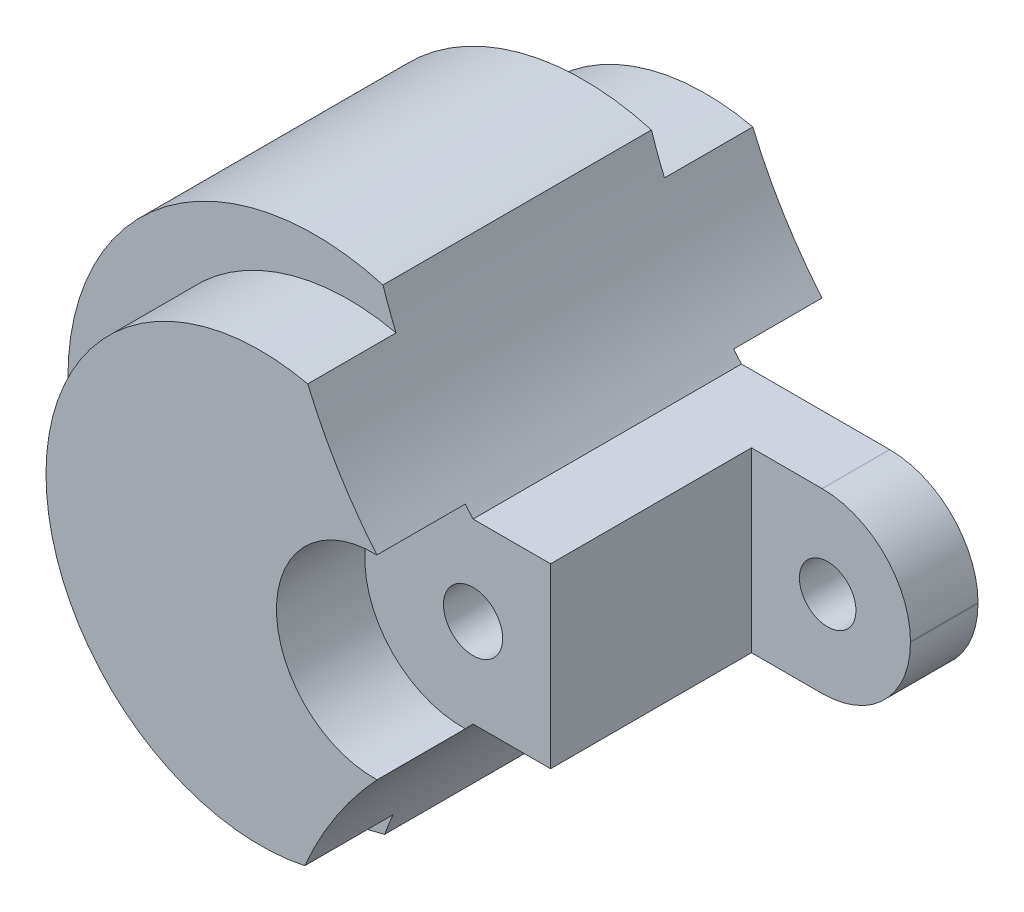
ISO-10303-21;
HEADER;
FILE_DESCRIPTION(('STEP AP214'),'2;1');
FILE_NAME('part.step','',(''),(''),'','','');
FILE_SCHEMA(('AUTOMOTIVE_DESIGN { 1 0 10303 214 1 1 1 1 }'));
ENDSEC;
DATA;
#1=APPLICATION_CONTEXT('core data for automotive mechanical design processes');
#2=APPLICATION_PROTOCOL_DEFINITION('international standard','automotive_design',2000,#1);
#3=PRODUCT_CONTEXT('',#1,'mechanical');
#4=PRODUCT('Part','Part','',(#3));
#5=PRODUCT_RELATED_PRODUCT_CATEGORY('part','',(#4));
#6=PRODUCT_DEFINITION_FORMATION('','',#4);
#7=PRODUCT_DEFINITION_CONTEXT('part definition',#1,'design');
#8=PRODUCT_DEFINITION('design','',#6,#7);
#9=PRODUCT_DEFINITION_SHAPE('','',#8);
#10=(LENGTH_UNIT() NAMED_UNIT(*) SI_UNIT(.MILLI.,.METRE.));
#11=(NAMED_UNIT(*) PLANE_ANGLE_UNIT() SI_UNIT($,.RADIAN.));
#12=(NAMED_UNIT(*) SI_UNIT($,.STERADIAN.) SOLID_ANGLE_UNIT());
#13=UNCERTAINTY_MEASURE_WITH_UNIT(LENGTH_MEASURE(1.E-05),#10,'distance_accuracy_value','');
#14=(GEOMETRIC_REPRESENTATION_CONTEXT(3) GLOBAL_UNCERTAINTY_ASSIGNED_CONTEXT((#13)) GLOBAL_UNIT_ASSIGNED_CONTEXT((#10,
#11,#12)) REPRESENTATION_CONTEXT('',''));
#15=CARTESIAN_POINT('',(0.,0.,0.));
#16=DIRECTION('',(0.,0.,1.));
#17=DIRECTION('',(1.,0.,0.));
#18=AXIS2_PLACEMENT_3D('',#15,#16,#17);
#19=CARTESIAN_POINT('',(-23.5470269701052,15.8760123838213,14.95));
#20=DIRECTION('',(0.,0.,1.));
#21=DIRECTION('',(1.,0.,0.));
#22=AXIS2_PLACEMENT_3D('',#19,#20,#21);
#23=PLANE('',#22);
#24=CARTESIAN_POINT('',(-30.589699273519,16.0095070511293,14.95));
#25=DIRECTION('',(0.,0.,1.));
#26=DIRECTION('',(1.,0.,0.));
#27=AXIS2_PLACEMENT_3D('',#24,#25,#26);
#28=CIRCLE('',#27,12.1384984454512);
#29=CARTESIAN_POINT('',(-27.9081699108447,27.848111056135,14.95));
#30=VERTEX_POINT('',#29);
#31=CARTESIAN_POINT('',(-28.078905501613,4.13352039126898,14.95));
#32=VERTEX_POINT('',#31);
#33=EDGE_CURVE('E50',#30,#32,#28,.T.);
#34=ORIENTED_EDGE('',*,*,#33,.F.);
#35=CARTESIAN_POINT('',(-4.52058876228532,37.6875726493922,14.95));
#36=DIRECTION('',(0.,0.,1.));
#37=DIRECTION('',(1.,0.,0.));
#38=AXIS2_PLACEMENT_3D('',#35,#36,#37);
#39=CIRCLE('',#38,25.3730951290069);
#40=CARTESIAN_POINT('',(-28.6466779395256,29.8309972225613,14.95));
#41=VERTEX_POINT('',#40);
#42=EDGE_CURVE('E260',#41,#30,#39,.T.);
#43=ORIENTED_EDGE('',*,*,#42,.F.);
#44=CARTESIAN_POINT('',(-32.4878901912363,16.3682676168199,14.95));
#45=DIRECTION('',(0.,0.,1.));
#46=DIRECTION('',(1.,0.,0.));
#47=AXIS2_PLACEMENT_3D('',#44,#45,#46);
#48=CIRCLE('',#47,14.);
#49=CARTESIAN_POINT('',(-28.5553209438088,2.93194002650756,14.95));
#50=VERTEX_POINT('',#49);
#51=EDGE_CURVE('E246',#50,#41,#48,.F.);
#52=ORIENTED_EDGE('',*,*,#51,.F.);
#53=CARTESIAN_POINT('',(-8.00801608864321,-4.51963796845459,14.95));
#54=DIRECTION('',(0.,0.,1.));
#55=DIRECTION('',(1.,0.,0.));
#56=AXIS2_PLACEMENT_3D('',#53,#54,#55);
#57=CIRCLE('',#56,21.8567552812881);
#58=EDGE_CURVE('E55',#32,#50,#57,.T.);
#59=ORIENTED_EDGE('',*,*,#58,.F.);
#60=EDGE_LOOP('',(#34,#43,#52,#59));
#61=FACE_BOUND('',#60,.T.);
#62=ADVANCED_FACE('F35',(#61),#23,.T.);
#63=CARTESIAN_POINT('',(-23.5470269701052,15.8760123838213,14.95));
#64=DIRECTION('',(0.,0.,1.));
#65=DIRECTION('',(1.,0.,0.));
#66=AXIS2_PLACEMENT_3D('',#63,#64,#65);
#67=CIRCLE('',#66,1.67396975610176);
#68=CARTESIAN_POINT('',(-21.8730572140035,15.8760123838213,14.95));
#69=VERTEX_POINT('',#68);
#70=EDGE_CURVE('E224',#69,#69,#67,.T.);
#71=ORIENTED_EDGE('',*,*,#70,.F.);
#72=EDGE_LOOP('',(#71));
#73=FACE_BOUND('',#72,.T.);
#74=CARTESIAN_POINT('',(-24.1657631019313,15.9070552291608,14.95));
#75=DIRECTION('',(0.,0.,1.));
#76=DIRECTION('',(1.,0.,0.));
#77=AXIS2_PLACEMENT_3D('',#74,#75,#76);
#78=CIRCLE('',#77,5.51200944546824);
#79=CARTESIAN_POINT('',(-23.9823356469283,10.3980986586583,14.95));
#80=VERTEX_POINT('',#79);
#81=CARTESIAN_POINT('',(-23.9894833854206,21.4162451504176,14.95));
#82=VERTEX_POINT('',#81);
#83=EDGE_CURVE('E163',#80,#82,#78,.F.);
#84=ORIENTED_EDGE('',*,*,#83,.F.);
#85=CARTESIAN_POINT('',(-23.5470269701053,10.8510123838213,14.95));
#86=VERTEX_POINT('',#85);
#87=EDGE_CURVE('E256',#86,#80,#57,.T.);
#88=ORIENTED_EDGE('',*,*,#87,.F.);
#89=DIRECTION('',(1.,0.,0.));
#90=VECTOR('',#89,1.);
#91=CARTESIAN_POINT('',(-12.6975161247221,10.8510123838213,14.95));
#92=LINE('',#91,#90);
#93=CARTESIAN_POINT('',(-19.1565451933856,10.8510123838213,14.95));
#94=VERTEX_POINT('',#93);
#95=EDGE_CURVE('E266',#86,#94,#92,.T.);
#96=ORIENTED_EDGE('',*,*,#95,.T.);
#97=DIRECTION('',(0.,1.,0.));
#98=VECTOR('',#97,1.);
#99=CARTESIAN_POINT('',(-19.1565451933856,15.8760123838213,14.95));
#100=LINE('',#99,#98);
#101=CARTESIAN_POINT('',(-19.1565451933856,20.9010123838213,14.95));
#102=VERTEX_POINT('',#101);
#103=EDGE_CURVE('E290',#94,#102,#100,.T.);
#104=ORIENTED_EDGE('',*,*,#103,.T.);
#105=DIRECTION('',(-1.,0.,0.));
#106=VECTOR('',#105,1.);
#107=CARTESIAN_POINT('',(-23.5470269701052,20.9010123838213,14.95));
#108=LINE('',#107,#106);
#109=CARTESIAN_POINT('',(-23.5470269701052,20.9010123838213,14.95));
#110=VERTEX_POINT('',#109);
#111=EDGE_CURVE('E269',#102,#110,#108,.T.);
#112=ORIENTED_EDGE('',*,*,#111,.T.);
#113=EDGE_CURVE('E262',#82,#110,#39,.T.);
#114=ORIENTED_EDGE('',*,*,#113,.F.);
#115=EDGE_LOOP('',(#84,#88,#96,#104,#112,#114));
#116=FACE_BOUND('',#115,.T.);
#117=ADVANCED_FACE('F350',(#73,#116),#23,.T.);
#118=CARTESIAN_POINT('',(0.,0.,-0.25));
#119=DIRECTION('',(0.,0.,1.));
#120=DIRECTION('',(1.,0.,0.));
#121=AXIS2_PLACEMENT_3D('',#118,#119,#120);
#122=PLANE('',#121);
#123=CARTESIAN_POINT('',(-30.5896992735186,16.0095070511293,-0.25));
#124=DIRECTION('',(0.,0.,-1.));
#125=DIRECTION('',(-1.,0.,0.));
#126=AXIS2_PLACEMENT_3D('',#123,#124,#125);
#127=CIRCLE('',#126,12.1384984454511);
#128=CARTESIAN_POINT('',(-28.078905501613,4.13352039126899,-0.25));
#129=VERTEX_POINT('',#128);
#130=CARTESIAN_POINT('',(-27.9081699108447,27.848111056135,-0.25));
#131=VERTEX_POINT('',#130);
#132=EDGE_CURVE('E199',#129,#131,#127,.T.);
#133=ORIENTED_EDGE('',*,*,#132,.F.);
#134=CARTESIAN_POINT('',(-8.00801608864321,-4.51963796845459,-0.25));
#135=DIRECTION('',(0.,0.,1.));
#136=DIRECTION('',(1.,0.,0.));
#137=AXIS2_PLACEMENT_3D('',#134,#135,#136);
#138=CIRCLE('',#137,21.8567552812881);
#139=CARTESIAN_POINT('',(-28.5553209438088,2.93194002650756,-0.25));
#140=VERTEX_POINT('',#139);
#141=EDGE_CURVE('E243',#129,#140,#138,.T.);
#142=ORIENTED_EDGE('',*,*,#141,.T.);
#143=CARTESIAN_POINT('',(-32.4878901912363,16.3682676168199,-0.25));
#144=DIRECTION('',(0.,0.,-1.));
#145=DIRECTION('',(1.,0.,0.));
#146=AXIS2_PLACEMENT_3D('',#143,#144,#145);
#147=CIRCLE('',#146,14.);
#148=CARTESIAN_POINT('',(-28.6466779395256,29.8309972225613,-0.25));
#149=VERTEX_POINT('',#148);
#150=EDGE_CURVE('E248',#140,#149,#147,.T.);
#151=ORIENTED_EDGE('',*,*,#150,.T.);
#152=CARTESIAN_POINT('',(-4.52058876228532,37.6875726493922,-0.25));
#153=DIRECTION('',(0.,0.,1.));
#154=DIRECTION('',(-1.,0.,0.));
#155=AXIS2_PLACEMENT_3D('',#152,#153,#154);
#156=CIRCLE('',#155,25.3730951290069);
#157=EDGE_CURVE('E244',#149,#131,#156,.T.);
#158=ORIENTED_EDGE('',*,*,#157,.T.);
#159=EDGE_LOOP('',(#133,#142,#151,#158));
#160=FACE_BOUND('',#159,.T.);
#161=ADVANCED_FACE('F369',(#160),#122,.F.);
#162=CARTESIAN_POINT('',(-14.843182560384,15.8760123838213,-0.25));
#163=DIRECTION('',(0.,0.,-1.));
#164=DIRECTION('',(-1.,0.,0.));
#165=AXIS2_PLACEMENT_3D('',#162,#163,#164);
#166=CIRCLE('',#165,1.6);
#167=CARTESIAN_POINT('',(-16.443182560384,15.8760123838213,-0.25));
#168=VERTEX_POINT('',#167);
#169=EDGE_CURVE('E275',#168,#168,#166,.T.);
#170=ORIENTED_EDGE('',*,*,#169,.F.);
#171=EDGE_LOOP('',(#170));
#172=FACE_BOUND('',#171,.T.);
#173=CARTESIAN_POINT('',(-23.5470269701052,15.8760123838213,-0.25));
#174=DIRECTION('',(0.,0.,-1.));
#175=DIRECTION('',(-1.,0.,0.));
#176=AXIS2_PLACEMENT_3D('',#173,#174,#175);
#177=CIRCLE('',#176,1.67396975610176);
#178=CARTESIAN_POINT('',(-25.220996726207,15.8760123838213,-0.25));
#179=VERTEX_POINT('',#178);
#180=EDGE_CURVE('E221',#179,#179,#177,.T.);
#181=ORIENTED_EDGE('',*,*,#180,.F.);
#182=EDGE_LOOP('',(#181));
#183=FACE_BOUND('',#182,.T.);
#184=CARTESIAN_POINT('',(-24.1657631019313,15.9070552291608,-0.25));
#185=DIRECTION('',(0.,0.,1.));
#186=DIRECTION('',(1.,0.,0.));
#187=AXIS2_PLACEMENT_3D('',#184,#185,#186);
#188=CIRCLE('',#187,5.51200944546824);
#189=CARTESIAN_POINT('',(-23.9894833854206,21.4162451504176,-0.25));
#190=VERTEX_POINT('',#189);
#191=CARTESIAN_POINT('',(-23.9823356469283,10.3980986586583,-0.25));
#192=VERTEX_POINT('',#191);
#193=EDGE_CURVE('E194',#190,#192,#188,.T.);
#194=ORIENTED_EDGE('',*,*,#193,.F.);
#195=CARTESIAN_POINT('',(-23.5470269701052,20.9010123838213,-0.25));
#196=VERTEX_POINT('',#195);
#197=EDGE_CURVE('E247',#190,#196,#156,.T.);
#198=ORIENTED_EDGE('',*,*,#197,.T.);
#199=DIRECTION('',(-1.,0.,0.));
#200=VECTOR('',#199,1.);
#201=CARTESIAN_POINT('',(-0.547026970105245,20.9010123838213,-0.25));
#202=LINE('',#201,#200);
#203=CARTESIAN_POINT('',(-15.1565451933856,20.9010123838213,-0.25));
#204=VERTEX_POINT('',#203);
#205=EDGE_CURVE('E284',#204,#196,#202,.T.);
#206=ORIENTED_EDGE('',*,*,#205,.F.);
#207=CARTESIAN_POINT('',(-15.1565451933856,15.9010123838213,-0.25));
#208=DIRECTION('',(0.,0.,1.));
#209=DIRECTION('',(1.,0.,0.));
#210=AXIS2_PLACEMENT_3D('',#207,#208,#209);
#211=CIRCLE('',#210,5.);
#212=CARTESIAN_POINT('',(-10.1565451933856,15.9010123838213,-0.25));
#213=VERTEX_POINT('',#212);
#214=EDGE_CURVE('E301',#204,#213,#211,.F.);
#215=ORIENTED_EDGE('',*,*,#214,.T.);
#216=DIRECTION('',(0.,1.,0.));
#217=VECTOR('',#216,1.);
#218=CARTESIAN_POINT('',(-10.1565451933856,20.9010123838213,-0.25));
#219=LINE('',#218,#217);
#220=CARTESIAN_POINT('',(-10.1565451933856,15.8510123838213,-0.25));
#221=VERTEX_POINT('',#220);
#222=EDGE_CURVE('E272',#221,#213,#219,.T.);
#223=ORIENTED_EDGE('',*,*,#222,.F.);
#224=CARTESIAN_POINT('',(-15.1565451933856,15.8510123838213,-0.25));
#225=DIRECTION('',(0.,0.,1.));
#226=DIRECTION('',(1.,0.,0.));
#227=AXIS2_PLACEMENT_3D('',#224,#225,#226);
#228=CIRCLE('',#227,5.);
#229=CARTESIAN_POINT('',(-15.1565451933856,10.8510123838213,-0.25));
#230=VERTEX_POINT('',#229);
#231=EDGE_CURVE('E299',#221,#230,#228,.F.);
#232=ORIENTED_EDGE('',*,*,#231,.T.);
#233=DIRECTION('',(1.,0.,0.));
#234=VECTOR('',#233,1.);
#235=CARTESIAN_POINT('',(-0.547026970105245,10.8510123838213,-0.25));
#236=LINE('',#235,#234);
#237=CARTESIAN_POINT('',(-23.5470269701052,10.8510123838213,-0.25));
#238=VERTEX_POINT('',#237);
#239=EDGE_CURVE('E287',#238,#230,#236,.T.);
#240=ORIENTED_EDGE('',*,*,#239,.F.);
#241=EDGE_CURVE('E251',#238,#192,#138,.T.);
#242=ORIENTED_EDGE('',*,*,#241,.T.);
#243=EDGE_LOOP('',(#194,#198,#206,#215,#223,#232,#240,#242));
#244=FACE_BOUND('',#243,.T.);
#245=ADVANCED_FACE('F326',(#172,#183,#244),#122,.F.);
#246=CARTESIAN_POINT('',(-0.547026970105245,10.8510123838213,2.2));
#247=DIRECTION('',(0.,1.,0.));
#248=DIRECTION('',(-1.,0.,0.));
#249=AXIS2_PLACEMENT_3D('',#246,#247,#248);
#250=PLANE('',#249);
#251=ORIENTED_EDGE('',*,*,#239,.T.);
#252=DIRECTION('',(0.,0.,-1.));
#253=VECTOR('',#252,1.);
#254=CARTESIAN_POINT('',(-15.1565451933856,10.8510123838213,2.2));
#255=LINE('',#254,#253);
#256=CARTESIAN_POINT('',(-15.1565451933856,10.8510123838213,3.57482200485381));
#257=VERTEX_POINT('',#256);
#258=EDGE_CURVE('E11',#230,#257,#255,.F.);
#259=ORIENTED_EDGE('',*,*,#258,.T.);
#260=DIRECTION('',(-1.,0.,0.));
#261=VECTOR('',#260,1.);
#262=CARTESIAN_POINT('',(-0.547026970105245,10.8510123838213,3.57482200485381));
#263=LINE('',#262,#261);
#264=CARTESIAN_POINT('',(-19.1565451933856,10.8510123838213,3.57482200485381));
#265=VERTEX_POINT('',#264);
#266=EDGE_CURVE('E238',#257,#265,#263,.T.);
#267=ORIENTED_EDGE('',*,*,#266,.T.);
#268=DIRECTION('',(0.,0.,-1.));
#269=VECTOR('',#268,1.);
#270=CARTESIAN_POINT('',(-19.1565451933856,10.8510123838213,2.2));
#271=LINE('',#270,#269);
#272=EDGE_CURVE('E232',#94,#265,#271,.T.);
#273=ORIENTED_EDGE('',*,*,#272,.F.);
#274=ORIENTED_EDGE('',*,*,#95,.F.);
#275=DIRECTION('',(0.,0.,-1.));
#276=VECTOR('',#275,1.);
#277=CARTESIAN_POINT('',(-23.5470269701052,10.8510123838213,84.1195819551623));
#278=LINE('',#277,#276);
#279=EDGE_CURVE('E281',#86,#238,#278,.T.);
#280=ORIENTED_EDGE('',*,*,#279,.T.);
#281=EDGE_LOOP('',(#251,#259,#267,#273,#274,#280));
#282=FACE_BOUND('',#281,.T.);
#283=ADVANCED_FACE('F335',(#282),#250,.F.);
#284=CARTESIAN_POINT('',(-0.547026970105245,20.9010123838213,2.2));
#285=DIRECTION('',(0.,-1.,0.));
#286=DIRECTION('',(0.,0.,-1.));
#287=AXIS2_PLACEMENT_3D('',#284,#285,#286);
#288=PLANE('',#287);
#289=DIRECTION('',(1.,0.,0.));
#290=VECTOR('',#289,1.);
#291=CARTESIAN_POINT('',(-0.547026970105245,20.9010123838213,3.57482200485381));
#292=LINE('',#291,#290);
#293=CARTESIAN_POINT('',(-19.1565451933856,20.9010123838213,3.57482200485381));
#294=VERTEX_POINT('',#293);
#295=CARTESIAN_POINT('',(-15.1565451933856,20.9010123838213,3.57482200485381));
#296=VERTEX_POINT('',#295);
#297=EDGE_CURVE('E235',#294,#296,#292,.T.);
#298=ORIENTED_EDGE('',*,*,#297,.T.);
#299=DIRECTION('',(0.,0.,-1.));
#300=VECTOR('',#299,1.);
#301=CARTESIAN_POINT('',(-15.1565451933856,20.9010123838213,2.2));
#302=LINE('',#301,#300);
#303=EDGE_CURVE('E296',#296,#204,#302,.T.);
#304=ORIENTED_EDGE('',*,*,#303,.T.);
#305=ORIENTED_EDGE('',*,*,#205,.T.);
#306=DIRECTION('',(0.,0.,-1.));
#307=VECTOR('',#306,1.);
#308=CARTESIAN_POINT('',(-23.5470269701052,20.9010123838213,84.1195819551623));
#309=LINE('',#308,#307);
#310=EDGE_CURVE('E278',#110,#196,#309,.T.);
#311=ORIENTED_EDGE('',*,*,#310,.F.);
#312=ORIENTED_EDGE('',*,*,#111,.F.);
#313=DIRECTION('',(0.,0.,1.));
#314=VECTOR('',#313,1.);
#315=CARTESIAN_POINT('',(-19.1565451933856,20.9010123838213,2.2));
#316=LINE('',#315,#314);
#317=EDGE_CURVE('E230',#294,#102,#316,.T.);
#318=ORIENTED_EDGE('',*,*,#317,.F.);
#319=EDGE_LOOP('',(#298,#304,#305,#311,#312,#318));
#320=FACE_BOUND('',#319,.T.);
#321=ADVANCED_FACE('F320',(#320),#288,.F.);
#322=CARTESIAN_POINT('',(-14.843182560384,15.8760123838213,5.75));
#323=DIRECTION('',(0.,0.,-1.));
#324=DIRECTION('',(-1.,0.,0.));
#325=AXIS2_PLACEMENT_3D('',#322,#323,#324);
#326=CYLINDRICAL_SURFACE('',#325,1.6);
#327=CARTESIAN_POINT('',(-14.843182560384,15.8760123838213,3.57482200485381));
#328=DIRECTION('',(0.,0.,-1.));
#329=DIRECTION('',(-1.,0.,0.));
#330=AXIS2_PLACEMENT_3D('',#327,#328,#329);
#331=CIRCLE('',#330,1.6);
#332=CARTESIAN_POINT('',(-16.443182560384,15.8760123838213,3.57482200485381));
#333=VERTEX_POINT('',#332);
#334=EDGE_CURVE('E240',#333,#333,#331,.F.);
#335=ORIENTED_EDGE('',*,*,#334,.T.);
#336=EDGE_LOOP('',(#335));
#337=FACE_BOUND('',#336,.T.);
#338=ORIENTED_EDGE('',*,*,#169,.T.);
#339=EDGE_LOOP('',(#338));
#340=FACE_BOUND('',#339,.T.);
#341=ADVANCED_FACE('F377',(#337,#340),#326,.F.);
#342=CARTESIAN_POINT('',(-10.1565451933856,20.9010123838213,9.75));
#343=DIRECTION('',(-1.,0.,0.));
#344=DIRECTION('',(0.,0.,1.));
#345=AXIS2_PLACEMENT_3D('',#342,#343,#344);
#346=PLANE('',#345);
#347=ORIENTED_EDGE('',*,*,#222,.T.);
#348=DIRECTION('',(0.,0.,-1.));
#349=VECTOR('',#348,1.);
#350=CARTESIAN_POINT('',(-10.1565451933856,15.9010123838213,9.75));
#351=LINE('',#350,#349);
#352=CARTESIAN_POINT('',(-10.1565451933856,15.9010123838213,3.57482200485381));
#353=VERTEX_POINT('',#352);
#354=EDGE_CURVE('E306',#213,#353,#351,.F.);
#355=ORIENTED_EDGE('',*,*,#354,.T.);
#356=DIRECTION('',(0.,-1.,0.));
#357=VECTOR('',#356,1.);
#358=CARTESIAN_POINT('',(-10.1565451933856,20.9010123838213,3.57482200485381));
#359=LINE('',#358,#357);
#360=CARTESIAN_POINT('',(-10.1565451933856,15.8510123838213,3.57482200485381));
#361=VERTEX_POINT('',#360);
#362=EDGE_CURVE('E293',#353,#361,#359,.T.);
#363=ORIENTED_EDGE('',*,*,#362,.T.);
#364=DIRECTION('',(0.,0.,-1.));
#365=VECTOR('',#364,1.);
#366=CARTESIAN_POINT('',(-10.1565451933856,15.8510123838213,9.75));
#367=LINE('',#366,#365);
#368=EDGE_CURVE('E303',#361,#221,#367,.T.);
#369=ORIENTED_EDGE('',*,*,#368,.T.);
#370=EDGE_LOOP('',(#347,#355,#363,#369));
#371=FACE_BOUND('',#370,.T.);
#372=ADVANCED_FACE('F328',(#371),#346,.F.);
#373=CARTESIAN_POINT('',(-32.4878901912363,16.3682676168199,51.1478342629866));
#374=DIRECTION('',(0.,0.,-1.));
#375=DIRECTION('',(-1.,0.,0.));
#376=AXIS2_PLACEMENT_3D('',#373,#374,#375);
#377=CYLINDRICAL_SURFACE('',#376,14.);
#378=DIRECTION('',(0.,0.,-1.));
#379=VECTOR('',#378,1.);
#380=CARTESIAN_POINT('',(-28.5553209438088,2.93194002650756,51.1478342629866));
#381=LINE('',#380,#379);
#382=EDGE_CURVE('E259',#50,#140,#381,.T.);
#383=ORIENTED_EDGE('',*,*,#382,.F.);
#384=ORIENTED_EDGE('',*,*,#51,.T.);
#385=DIRECTION('',(0.,0.,-1.));
#386=VECTOR('',#385,1.);
#387=CARTESIAN_POINT('',(-28.6466779395256,29.8309972225613,51.1478342629866));
#388=LINE('',#387,#386);
#389=EDGE_CURVE('E255',#41,#149,#388,.T.);
#390=ORIENTED_EDGE('',*,*,#389,.T.);
#391=ORIENTED_EDGE('',*,*,#150,.F.);
#392=EDGE_LOOP('',(#383,#384,#390,#391));
#393=FACE_BOUND('',#392,.T.);
#394=ADVANCED_FACE('F373',(#393),#377,.T.);
#395=CARTESIAN_POINT('',(-4.52058876228532,37.6875726493922,51.1478342629866));
#396=DIRECTION('',(0.,0.,-1.));
#397=DIRECTION('',(-1.,0.,0.));
#398=AXIS2_PLACEMENT_3D('',#395,#396,#397);
#399=CYLINDRICAL_SURFACE('',#398,25.3730951290069);
#400=ORIENTED_EDGE('',*,*,#197,.F.);
#401=DIRECTION('',(0.,0.,1.));
#402=VECTOR('',#401,1.);
#403=CARTESIAN_POINT('',(-23.9894833854206,21.4162451504176,-5.25));
#404=LINE('',#403,#402);
#405=CARTESIAN_POINT('',(-23.9894833854206,21.4162451504176,-5.25));
#406=VERTEX_POINT('',#405);
#407=EDGE_CURVE('E218',#406,#190,#404,.T.);
#408=ORIENTED_EDGE('',*,*,#407,.F.);
#409=CARTESIAN_POINT('',(-4.52058876221977,37.6875726494318,-5.25));
#410=DIRECTION('',(0.,0.,1.));
#411=DIRECTION('',(-1.,0.,0.));
#412=AXIS2_PLACEMENT_3D('',#409,#410,#411);
#413=CIRCLE('',#412,25.3730951290826);
#414=CARTESIAN_POINT('',(-27.9081699108447,27.848111056135,-5.25));
#415=VERTEX_POINT('',#414);
#416=EDGE_CURVE('E195',#415,#406,#413,.T.);
#417=ORIENTED_EDGE('',*,*,#416,.F.);
#418=DIRECTION('',(0.,0.,1.));
#419=VECTOR('',#418,1.);
#420=CARTESIAN_POINT('',(-27.9081699108447,27.848111056135,-5.25));
#421=LINE('',#420,#419);
#422=EDGE_CURVE('E205',#415,#131,#421,.T.);
#423=ORIENTED_EDGE('',*,*,#422,.T.);
#424=ORIENTED_EDGE('',*,*,#157,.F.);
#425=ORIENTED_EDGE('',*,*,#389,.F.);
#426=ORIENTED_EDGE('',*,*,#42,.T.);
#427=DIRECTION('',(0.,0.,-1.));
#428=VECTOR('',#427,1.);
#429=CARTESIAN_POINT('',(-27.9081699108447,27.848111056135,19.95));
#430=LINE('',#429,#428);
#431=CARTESIAN_POINT('',(-27.9081699108447,27.848111056135,19.95));
#432=VERTEX_POINT('',#431);
#433=EDGE_CURVE('E182',#432,#30,#430,.T.);
#434=ORIENTED_EDGE('',*,*,#433,.F.);
#435=CARTESIAN_POINT('',(-4.52058876228584,37.6875726493919,19.95));
#436=DIRECTION('',(0.,0.,1.));
#437=DIRECTION('',(1.,0.,0.));
#438=AXIS2_PLACEMENT_3D('',#435,#436,#437);
#439=CIRCLE('',#438,25.3730951290063);
#440=CARTESIAN_POINT('',(-23.9894833854206,21.4162451504176,19.95));
#441=VERTEX_POINT('',#440);
#442=EDGE_CURVE('E174',#432,#441,#439,.T.);
#443=ORIENTED_EDGE('',*,*,#442,.T.);
#444=DIRECTION('',(0.,0.,-1.));
#445=VECTOR('',#444,1.);
#446=CARTESIAN_POINT('',(-23.9894833854206,21.4162451504176,19.95));
#447=LINE('',#446,#445);
#448=EDGE_CURVE('E158',#441,#82,#447,.T.);
#449=ORIENTED_EDGE('',*,*,#448,.T.);
#450=ORIENTED_EDGE('',*,*,#113,.T.);
#451=ORIENTED_EDGE('',*,*,#310,.T.);
#452=EDGE_LOOP('',(#400,#408,#417,#423,#424,#425,#426,#434,#443,#449,#450,#451));
#453=FACE_BOUND('',#452,.T.);
#454=ADVANCED_FACE('F180',(#453),#399,.F.);
#455=CARTESIAN_POINT('',(-8.00801608864321,-4.51963796845459,51.1478342629866));
#456=DIRECTION('',(0.,0.,-1.));
#457=DIRECTION('',(-1.,0.,0.));
#458=AXIS2_PLACEMENT_3D('',#455,#456,#457);
#459=CYLINDRICAL_SURFACE('',#458,21.8567552812881);
#460=ORIENTED_EDGE('',*,*,#87,.T.);
#461=DIRECTION('',(0.,0.,-1.));
#462=VECTOR('',#461,1.);
#463=CARTESIAN_POINT('',(-23.9823356469283,10.3980986586583,19.95));
#464=LINE('',#463,#462);
#465=CARTESIAN_POINT('',(-23.9823356469283,10.3980986586583,19.95));
#466=VERTEX_POINT('',#465);
#467=EDGE_CURVE('E166',#466,#80,#464,.T.);
#468=ORIENTED_EDGE('',*,*,#467,.F.);
#469=CARTESIAN_POINT('',(-8.00801608864396,-4.51963796845413,19.95));
#470=DIRECTION('',(0.,0.,1.));
#471=DIRECTION('',(1.,0.,0.));
#472=AXIS2_PLACEMENT_3D('',#469,#470,#471);
#473=CIRCLE('',#472,21.8567552812873);
#474=CARTESIAN_POINT('',(-28.078905501613,4.13352039126899,19.95));
#475=VERTEX_POINT('',#474);
#476=EDGE_CURVE('E177',#466,#475,#473,.T.);
#477=ORIENTED_EDGE('',*,*,#476,.T.);
#478=DIRECTION('',(0.,0.,-1.));
#479=VECTOR('',#478,1.);
#480=CARTESIAN_POINT('',(-28.078905501613,4.13352039126899,19.95));
#481=LINE('',#480,#479);
#482=EDGE_CURVE('E188',#475,#32,#481,.T.);
#483=ORIENTED_EDGE('',*,*,#482,.T.);
#484=ORIENTED_EDGE('',*,*,#58,.T.);
#485=ORIENTED_EDGE('',*,*,#382,.T.);
#486=ORIENTED_EDGE('',*,*,#141,.F.);
#487=DIRECTION('',(0.,0.,1.));
#488=VECTOR('',#487,1.);
#489=CARTESIAN_POINT('',(-28.078905501613,4.13352039126899,-5.25));
#490=LINE('',#489,#488);
#491=CARTESIAN_POINT('',(-28.078905501613,4.13352039126899,-5.25));
#492=VERTEX_POINT('',#491);
#493=EDGE_CURVE('E212',#492,#129,#490,.T.);
#494=ORIENTED_EDGE('',*,*,#493,.F.);
#495=CARTESIAN_POINT('',(-8.0080160886355,-4.51963796845966,-5.25));
#496=DIRECTION('',(0.,0.,1.));
#497=DIRECTION('',(1.,0.,0.));
#498=AXIS2_PLACEMENT_3D('',#495,#496,#497);
#499=CIRCLE('',#498,21.8567552812972);
#500=CARTESIAN_POINT('',(-23.9823356469283,10.3980986586583,-5.25));
#501=VERTEX_POINT('',#500);
#502=EDGE_CURVE('E201',#501,#492,#499,.T.);
#503=ORIENTED_EDGE('',*,*,#502,.F.);
#504=DIRECTION('',(0.,0.,1.));
#505=VECTOR('',#504,1.);
#506=CARTESIAN_POINT('',(-23.9823356469283,10.3980986586583,-5.25));
#507=LINE('',#506,#505);
#508=EDGE_CURVE('E215',#501,#192,#507,.T.);
#509=ORIENTED_EDGE('',*,*,#508,.T.);
#510=ORIENTED_EDGE('',*,*,#241,.F.);
#511=ORIENTED_EDGE('',*,*,#279,.F.);
#512=EDGE_LOOP('',(#460,#468,#477,#483,#484,#485,#486,#494,#503,#509,#510,#511));
#513=FACE_BOUND('',#512,.T.);
#514=ADVANCED_FACE('F341',(#513),#459,.F.);
#515=CARTESIAN_POINT('',(-19.1565451933856,21.4962086297097,3.57482200485381));
#516=DIRECTION('',(0.,0.,-1.));
#517=DIRECTION('',(-1.,0.,0.));
#518=AXIS2_PLACEMENT_3D('',#515,#516,#517);
#519=PLANE('',#518);
#520=ORIENTED_EDGE('',*,*,#362,.F.);
#521=CARTESIAN_POINT('',(-15.1565451933856,15.9010123838213,3.57482200485381));
#522=DIRECTION('',(0.,0.,-1.));
#523=DIRECTION('',(-1.,0.,0.));
#524=AXIS2_PLACEMENT_3D('',#521,#522,#523);
#525=CIRCLE('',#524,5.);
#526=EDGE_CURVE('E43',#353,#296,#525,.F.);
#527=ORIENTED_EDGE('',*,*,#526,.T.);
#528=ORIENTED_EDGE('',*,*,#297,.F.);
#529=DIRECTION('',(0.,1.,0.));
#530=VECTOR('',#529,1.);
#531=CARTESIAN_POINT('',(-19.1565451933856,21.4962086297097,3.57482200485381));
#532=LINE('',#531,#530);
#533=EDGE_CURVE('E227',#265,#294,#532,.T.);
#534=ORIENTED_EDGE('',*,*,#533,.F.);
#535=ORIENTED_EDGE('',*,*,#266,.F.);
#536=CARTESIAN_POINT('',(-15.1565451933856,15.8510123838213,3.57482200485381));
#537=DIRECTION('',(0.,0.,-1.));
#538=DIRECTION('',(-1.,0.,0.));
#539=AXIS2_PLACEMENT_3D('',#536,#537,#538);
#540=CIRCLE('',#539,5.);
#541=EDGE_CURVE('E308',#257,#361,#540,.F.);
#542=ORIENTED_EDGE('',*,*,#541,.T.);
#543=EDGE_LOOP('',(#520,#527,#528,#534,#535,#542));
#544=FACE_BOUND('',#543,.T.);
#545=ORIENTED_EDGE('',*,*,#334,.F.);
#546=EDGE_LOOP('',(#545));
#547=FACE_BOUND('',#546,.T.);
#548=ADVANCED_FACE('F312',(#544,#547),#519,.F.);
#549=CARTESIAN_POINT('',(-19.1565451933856,0.,0.));
#550=DIRECTION('',(1.,0.,0.));
#551=DIRECTION('',(0.,0.,-1.));
#552=AXIS2_PLACEMENT_3D('',#549,#550,#551);
#553=PLANE('',#552);
#554=ORIENTED_EDGE('',*,*,#272,.T.);
#555=ORIENTED_EDGE('',*,*,#533,.T.);
#556=ORIENTED_EDGE('',*,*,#317,.T.);
#557=ORIENTED_EDGE('',*,*,#103,.F.);
#558=EDGE_LOOP('',(#554,#555,#556,#557));
#559=FACE_BOUND('',#558,.T.);
#560=ADVANCED_FACE('F352',(#559),#553,.T.);
#561=CARTESIAN_POINT('',(-23.5470269701052,15.8760123838213,19.75));
#562=DIRECTION('',(0.,0.,-1.));
#563=DIRECTION('',(-1.,0.,0.));
#564=AXIS2_PLACEMENT_3D('',#561,#562,#563);
#565=CYLINDRICAL_SURFACE('',#564,1.67396975610176);
#566=ORIENTED_EDGE('',*,*,#70,.T.);
#567=EDGE_LOOP('',(#566));
#568=FACE_BOUND('',#567,.T.);
#569=ORIENTED_EDGE('',*,*,#180,.T.);
#570=EDGE_LOOP('',(#569));
#571=FACE_BOUND('',#570,.T.);
#572=ADVANCED_FACE('F354',(#568,#571),#565,.F.);
#573=CARTESIAN_POINT('',(-15.1565451933856,15.9010123838213,2.2));
#574=DIRECTION('',(0.,0.,-1.));
#575=DIRECTION('',(-1.,0.,0.));
#576=AXIS2_PLACEMENT_3D('',#573,#574,#575);
#577=CYLINDRICAL_SURFACE('',#576,5.);
#578=ORIENTED_EDGE('',*,*,#526,.F.);
#579=ORIENTED_EDGE('',*,*,#354,.F.);
#580=ORIENTED_EDGE('',*,*,#214,.F.);
#581=ORIENTED_EDGE('',*,*,#303,.F.);
#582=EDGE_LOOP('',(#578,#579,#580,#581));
#583=FACE_BOUND('',#582,.T.);
#584=ADVANCED_FACE('F323',(#583),#577,.T.);
#585=CARTESIAN_POINT('',(-15.1565451933856,15.8510123838213,9.75));
#586=DIRECTION('',(0.,0.,-1.));
#587=DIRECTION('',(-1.,0.,0.));
#588=AXIS2_PLACEMENT_3D('',#585,#586,#587);
#589=CYLINDRICAL_SURFACE('',#588,5.);
#590=ORIENTED_EDGE('',*,*,#541,.F.);
#591=ORIENTED_EDGE('',*,*,#258,.F.);
#592=ORIENTED_EDGE('',*,*,#231,.F.);
#593=ORIENTED_EDGE('',*,*,#368,.F.);
#594=EDGE_LOOP('',(#590,#591,#592,#593));
#595=FACE_BOUND('',#594,.T.);
#596=ADVANCED_FACE('F37',(#595),#589,.T.);
#597=CARTESIAN_POINT('',(-24.1657631019313,15.9070552291608,-5.25));
#598=DIRECTION('',(0.,0.,1.));
#599=DIRECTION('',(1.,0.,0.));
#600=AXIS2_PLACEMENT_3D('',#597,#598,#599);
#601=CYLINDRICAL_SURFACE('',#600,5.51200944546824);
#602=ORIENTED_EDGE('',*,*,#193,.T.);
#603=ORIENTED_EDGE('',*,*,#508,.F.);
#604=CARTESIAN_POINT('',(-24.1657631019313,15.9070552291608,-5.25));
#605=DIRECTION('',(0.,0.,1.));
#606=DIRECTION('',(1.,0.,0.));
#607=AXIS2_PLACEMENT_3D('',#604,#605,#606);
#608=CIRCLE('',#607,5.51200944546824);
#609=EDGE_CURVE('E198',#406,#501,#608,.T.);
#610=ORIENTED_EDGE('',*,*,#609,.F.);
#611=ORIENTED_EDGE('',*,*,#407,.T.);
#612=EDGE_LOOP('',(#602,#603,#610,#611));
#613=FACE_BOUND('',#612,.T.);
#614=ADVANCED_FACE('F345',(#613),#601,.F.);
#615=CARTESIAN_POINT('',(-30.5896992735186,16.0095070511293,-5.25));
#616=DIRECTION('',(0.,0.,1.));
#617=DIRECTION('',(1.,0.,0.));
#618=AXIS2_PLACEMENT_3D('',#615,#616,#617);
#619=CYLINDRICAL_SURFACE('',#618,12.1384984454511);
#620=ORIENTED_EDGE('',*,*,#132,.T.);
#621=ORIENTED_EDGE('',*,*,#422,.F.);
#622=CARTESIAN_POINT('',(-30.5896992735186,16.0095070511293,-5.25));
#623=DIRECTION('',(0.,0.,-1.));
#624=DIRECTION('',(-1.,0.,0.));
#625=AXIS2_PLACEMENT_3D('',#622,#623,#624);
#626=CIRCLE('',#625,12.1384984454511);
#627=EDGE_CURVE('E203',#492,#415,#626,.T.);
#628=ORIENTED_EDGE('',*,*,#627,.F.);
#629=ORIENTED_EDGE('',*,*,#493,.T.);
#630=EDGE_LOOP('',(#620,#621,#628,#629));
#631=FACE_BOUND('',#630,.T.);
#632=ADVANCED_FACE('F394',(#631),#619,.T.);
#633=CARTESIAN_POINT('',(-17.5551440178692,26.8485398502806,-5.25));
#634=DIRECTION('',(0.,0.,-1.));
#635=DIRECTION('',(-1.,0.,0.));
#636=AXIS2_PLACEMENT_3D('',#633,#634,#635);
#637=PLANE('',#636);
#638=ORIENTED_EDGE('',*,*,#416,.T.);
#639=ORIENTED_EDGE('',*,*,#609,.T.);
#640=ORIENTED_EDGE('',*,*,#502,.T.);
#641=ORIENTED_EDGE('',*,*,#627,.T.);
#642=EDGE_LOOP('',(#638,#639,#640,#641));
#643=FACE_BOUND('',#642,.T.);
#644=ADVANCED_FACE('F399',(#643),#637,.T.);
#645=CARTESIAN_POINT('',(-30.589699273519,16.0095070511293,19.95));
#646=DIRECTION('',(0.,0.,-1.));
#647=DIRECTION('',(-1.,0.,0.));
#648=AXIS2_PLACEMENT_3D('',#645,#646,#647);
#649=CYLINDRICAL_SURFACE('',#648,12.1384984454512);
#650=ORIENTED_EDGE('',*,*,#433,.T.);
#651=ORIENTED_EDGE('',*,*,#33,.T.);
#652=ORIENTED_EDGE('',*,*,#482,.F.);
#653=CARTESIAN_POINT('',(-30.589699273519,16.0095070511293,19.95));
#654=DIRECTION('',(0.,0.,-1.));
#655=DIRECTION('',(-1.,0.,0.));
#656=AXIS2_PLACEMENT_3D('',#653,#654,#655);
#657=CIRCLE('',#656,12.1384984454512);
#658=EDGE_CURVE('E167',#475,#432,#657,.T.);
#659=ORIENTED_EDGE('',*,*,#658,.T.);
#660=EDGE_LOOP('',(#650,#651,#652,#659));
#661=FACE_BOUND('',#660,.T.);
#662=ADVANCED_FACE('F405',(#661),#649,.T.);
#663=CARTESIAN_POINT('',(-24.1657631019313,15.9070552291608,19.95));
#664=DIRECTION('',(0.,0.,-1.));
#665=DIRECTION('',(-1.,0.,0.));
#666=AXIS2_PLACEMENT_3D('',#663,#664,#665);
#667=CYLINDRICAL_SURFACE('',#666,5.51200944546824);
#668=ORIENTED_EDGE('',*,*,#467,.T.);
#669=ORIENTED_EDGE('',*,*,#83,.T.);
#670=ORIENTED_EDGE('',*,*,#448,.F.);
#671=CARTESIAN_POINT('',(-24.1657631019313,15.9070552291608,19.95));
#672=DIRECTION('',(0.,0.,1.));
#673=DIRECTION('',(1.,0.,0.));
#674=AXIS2_PLACEMENT_3D('',#671,#672,#673);
#675=CIRCLE('',#674,5.51200944546824);
#676=EDGE_CURVE('E162',#441,#466,#675,.T.);
#677=ORIENTED_EDGE('',*,*,#676,.T.);
#678=EDGE_LOOP('',(#668,#669,#670,#677));
#679=FACE_BOUND('',#678,.T.);
#680=ADVANCED_FACE('F161',(#679),#667,.F.);
#681=CARTESIAN_POINT('',(-14.3431759321086,26.7973139392763,19.95));
#682=DIRECTION('',(0.,0.,1.));
#683=DIRECTION('',(1.,0.,0.));
#684=AXIS2_PLACEMENT_3D('',#681,#682,#683);
#685=PLANE('',#684);
#686=ORIENTED_EDGE('',*,*,#442,.F.);
#687=ORIENTED_EDGE('',*,*,#658,.F.);
#688=ORIENTED_EDGE('',*,*,#476,.F.);
#689=ORIENTED_EDGE('',*,*,#676,.F.);
#690=EDGE_LOOP('',(#686,#687,#688,#689));
#691=FACE_BOUND('',#690,.T.);
#692=ADVANCED_FACE('F172',(#691),#685,.T.);
#693=CLOSED_SHELL('',(#62,#117,#161,#245,#283,#321,#341,#372,#394,#454,#514,#548,#560,#572,#584,
#596,#614,#632,#644,#662,#680,#692));
#694=MANIFOLD_SOLID_BREP('B2',#693);
#695=ADVANCED_BREP_SHAPE_REPRESENTATION('',(#18,#694),#14);
#696=SHAPE_DEFINITION_REPRESENTATION(#9,#695);
ENDSEC;
END-ISO-10303-21;
